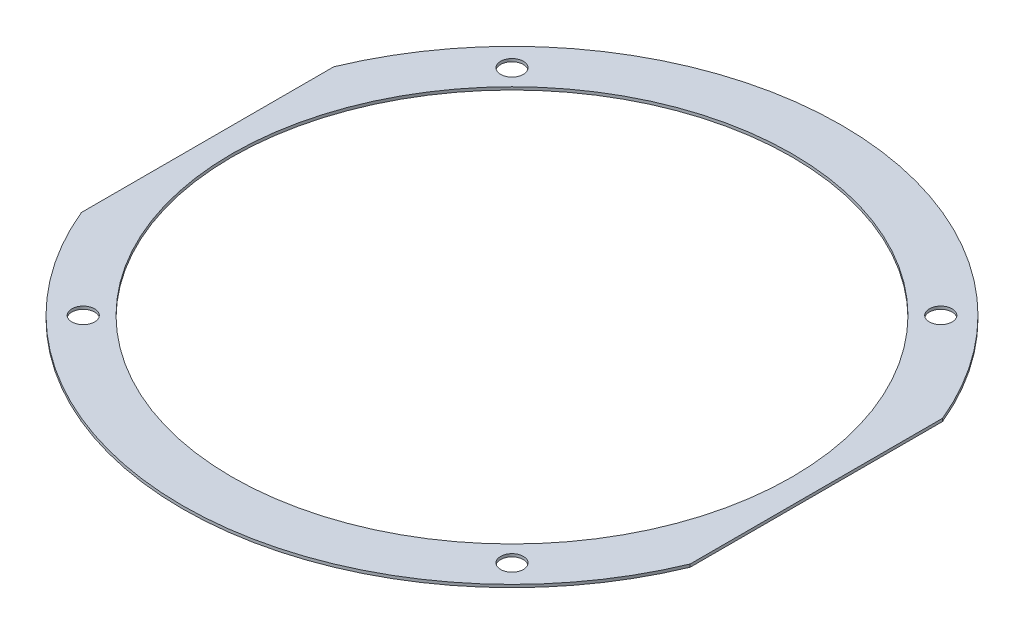
ISO-10303-21;
HEADER;
FILE_DESCRIPTION(('STEP AP214'),'2;1');
FILE_NAME('part.step','',(''),(''),'','','');
FILE_SCHEMA(('AUTOMOTIVE_DESIGN { 1 0 10303 214 1 1 1 1 }'));
ENDSEC;
DATA;
#1=APPLICATION_CONTEXT('core data for automotive mechanical design processes');
#2=APPLICATION_PROTOCOL_DEFINITION('international standard','automotive_design',2000,#1);
#3=PRODUCT_CONTEXT('',#1,'mechanical');
#4=PRODUCT('Part','Part','',(#3));
#5=PRODUCT_RELATED_PRODUCT_CATEGORY('part','',(#4));
#6=PRODUCT_DEFINITION_FORMATION('','',#4);
#7=PRODUCT_DEFINITION_CONTEXT('part definition',#1,'design');
#8=PRODUCT_DEFINITION('design','',#6,#7);
#9=PRODUCT_DEFINITION_SHAPE('','',#8);
#10=(LENGTH_UNIT() NAMED_UNIT(*) SI_UNIT(.MILLI.,.METRE.));
#11=(NAMED_UNIT(*) PLANE_ANGLE_UNIT() SI_UNIT($,.RADIAN.));
#12=(NAMED_UNIT(*) SI_UNIT($,.STERADIAN.) SOLID_ANGLE_UNIT());
#13=UNCERTAINTY_MEASURE_WITH_UNIT(LENGTH_MEASURE(1.E-05),#10,'distance_accuracy_value','');
#14=(GEOMETRIC_REPRESENTATION_CONTEXT(3) GLOBAL_UNCERTAINTY_ASSIGNED_CONTEXT((#13)) GLOBAL_UNIT_ASSIGNED_CONTEXT((#10,
#11,#12)) REPRESENTATION_CONTEXT('',''));
#15=CARTESIAN_POINT('',(0.,0.,0.));
#16=DIRECTION('',(0.,0.,1.));
#17=DIRECTION('',(1.,0.,0.));
#18=AXIS2_PLACEMENT_3D('',#15,#16,#17);
#19=CARTESIAN_POINT('',(0.,0.25,0.));
#20=DIRECTION('',(0.,1.,0.));
#21=DIRECTION('',(0.,0.,1.));
#22=AXIS2_PLACEMENT_3D('',#19,#20,#21);
#23=PLANE('',#22);
#24=CARTESIAN_POINT('',(-18.8398777252419,0.25,18.8398777252415));
#25=DIRECTION('',(0.,1.,0.));
#26=DIRECTION('',(0.,0.,1.));
#27=AXIS2_PLACEMENT_3D('',#24,#25,#26);
#28=CIRCLE('',#27,0.999999999999998);
#29=CARTESIAN_POINT('',(-18.8398777252419,0.25,19.8398777252415));
#30=VERTEX_POINT('',#29);
#31=EDGE_CURVE('E134',#30,#30,#28,.T.);
#32=ORIENTED_EDGE('',*,*,#31,.F.);
#33=EDGE_LOOP('',(#32));
#34=FACE_BOUND('',#33,.T.);
#35=CARTESIAN_POINT('',(18.8398777252419,0.25,-18.8398777252415));
#36=DIRECTION('',(0.,1.,0.));
#37=DIRECTION('',(0.,0.,1.));
#38=AXIS2_PLACEMENT_3D('',#35,#36,#37);
#39=CIRCLE('',#38,0.999999999999998);
#40=CARTESIAN_POINT('',(18.8398777252419,0.25,-17.8398777252415));
#41=VERTEX_POINT('',#40);
#42=EDGE_CURVE('E121',#41,#41,#39,.T.);
#43=ORIENTED_EDGE('',*,*,#42,.F.);
#44=EDGE_LOOP('',(#43));
#45=FACE_BOUND('',#44,.T.);
#46=CARTESIAN_POINT('',(0.,0.25,0.));
#47=DIRECTION('',(0.,1.,0.));
#48=DIRECTION('',(0.,0.,1.));
#49=AXIS2_PLACEMENT_3D('',#46,#47,#48);
#50=CIRCLE('',#49,28.9571402446805);
#51=CARTESIAN_POINT('',(26.75,0.25,-11.0884386254376));
#52=VERTEX_POINT('',#51);
#53=CARTESIAN_POINT('',(-26.75,0.25,-11.0884386254376));
#54=VERTEX_POINT('',#53);
#55=EDGE_CURVE('E93',#52,#54,#50,.T.);
#56=ORIENTED_EDGE('',*,*,#55,.T.);
#57=DIRECTION('',(0.,0.,1.));
#58=VECTOR('',#57,1.);
#59=CARTESIAN_POINT('',(-26.75,0.25,-11.0884386254376));
#60=LINE('',#59,#58);
#61=CARTESIAN_POINT('',(-26.75,0.25,11.0884386254376));
#62=VERTEX_POINT('',#61);
#63=EDGE_CURVE('E88',#54,#62,#60,.T.);
#64=ORIENTED_EDGE('',*,*,#63,.T.);
#65=CARTESIAN_POINT('',(0.,0.25,0.));
#66=DIRECTION('',(0.,1.,0.));
#67=DIRECTION('',(0.,0.,1.));
#68=AXIS2_PLACEMENT_3D('',#65,#66,#67);
#69=CIRCLE('',#68,28.9571402446805);
#70=CARTESIAN_POINT('',(26.75,0.25,11.0884386254376));
#71=VERTEX_POINT('',#70);
#72=EDGE_CURVE('E91',#62,#71,#69,.T.);
#73=ORIENTED_EDGE('',*,*,#72,.T.);
#74=DIRECTION('',(0.,0.,-1.));
#75=VECTOR('',#74,1.);
#76=CARTESIAN_POINT('',(26.75,0.25,11.0884386254376));
#77=LINE('',#76,#75);
#78=EDGE_CURVE('E59',#71,#52,#77,.T.);
#79=ORIENTED_EDGE('',*,*,#78,.T.);
#80=EDGE_LOOP('',(#56,#64,#73,#79));
#81=FACE_BOUND('',#80,.T.);
#82=CARTESIAN_POINT('',(18.8398777252414,0.25,18.839877725242));
#83=DIRECTION('',(0.,1.,0.));
#84=DIRECTION('',(0.,0.,1.));
#85=AXIS2_PLACEMENT_3D('',#82,#83,#84);
#86=CIRCLE('',#85,0.999999999999998);
#87=CARTESIAN_POINT('',(18.8398777252414,0.25,19.839877725242));
#88=VERTEX_POINT('',#87);
#89=EDGE_CURVE('E109',#88,#88,#86,.T.);
#90=ORIENTED_EDGE('',*,*,#89,.F.);
#91=EDGE_LOOP('',(#90));
#92=FACE_BOUND('',#91,.T.);
#93=CARTESIAN_POINT('',(-18.8398777252413,0.25,-18.8398777252421));
#94=DIRECTION('',(0.,1.,0.));
#95=DIRECTION('',(0.,0.,1.));
#96=AXIS2_PLACEMENT_3D('',#93,#94,#95);
#97=CIRCLE('',#96,0.999999999999998);
#98=CARTESIAN_POINT('',(-18.8398777252413,0.25,-17.8398777252421));
#99=VERTEX_POINT('',#98);
#100=EDGE_CURVE('E129',#99,#99,#97,.T.);
#101=ORIENTED_EDGE('',*,*,#100,.F.);
#102=EDGE_LOOP('',(#101));
#103=FACE_BOUND('',#102,.T.);
#104=CARTESIAN_POINT('',(0.,0.25,0.));
#105=DIRECTION('',(0.,1.,0.));
#106=DIRECTION('',(0.,0.,1.));
#107=AXIS2_PLACEMENT_3D('',#104,#105,#106);
#108=CIRCLE('',#107,24.6071402446805);
#109=CARTESIAN_POINT('',(0.,0.25,24.6071402446805));
#110=VERTEX_POINT('',#109);
#111=EDGE_CURVE('E141',#110,#110,#108,.T.);
#112=ORIENTED_EDGE('',*,*,#111,.F.);
#113=EDGE_LOOP('',(#112));
#114=FACE_BOUND('',#113,.T.);
#115=ADVANCED_FACE('F41',(#34,#45,#81,#92,#103,#114),#23,.T.);
#116=CARTESIAN_POINT('',(0.,0.,0.));
#117=DIRECTION('',(0.,1.,0.));
#118=DIRECTION('',(0.,0.,1.));
#119=AXIS2_PLACEMENT_3D('',#116,#117,#118);
#120=PLANE('',#119);
#121=CARTESIAN_POINT('',(0.,0.,0.));
#122=DIRECTION('',(0.,1.,0.));
#123=DIRECTION('',(0.,0.,1.));
#124=AXIS2_PLACEMENT_3D('',#121,#122,#123);
#125=CIRCLE('',#124,28.9571402446805);
#126=CARTESIAN_POINT('',(26.75,0.,-11.0884386254376));
#127=VERTEX_POINT('',#126);
#128=CARTESIAN_POINT('',(-26.75,0.,-11.0884386254376));
#129=VERTEX_POINT('',#128);
#130=EDGE_CURVE('E103',#127,#129,#125,.T.);
#131=ORIENTED_EDGE('',*,*,#130,.F.);
#132=DIRECTION('',(0.,0.,-1.));
#133=VECTOR('',#132,1.);
#134=CARTESIAN_POINT('',(26.75,0.,11.0884386254376));
#135=LINE('',#134,#133);
#136=CARTESIAN_POINT('',(26.75,0.,11.0884386254376));
#137=VERTEX_POINT('',#136);
#138=EDGE_CURVE('E83',#137,#127,#135,.T.);
#139=ORIENTED_EDGE('',*,*,#138,.F.);
#140=CARTESIAN_POINT('',(0.,0.,0.));
#141=DIRECTION('',(0.,1.,0.));
#142=DIRECTION('',(0.,0.,1.));
#143=AXIS2_PLACEMENT_3D('',#140,#141,#142);
#144=CIRCLE('',#143,28.9571402446805);
#145=CARTESIAN_POINT('',(-26.75,0.,11.0884386254376));
#146=VERTEX_POINT('',#145);
#147=EDGE_CURVE('E75',#146,#137,#144,.T.);
#148=ORIENTED_EDGE('',*,*,#147,.F.);
#149=DIRECTION('',(0.,0.,1.));
#150=VECTOR('',#149,1.);
#151=CARTESIAN_POINT('',(-26.75,0.,-11.0884386254376));
#152=LINE('',#151,#150);
#153=EDGE_CURVE('E100',#129,#146,#152,.T.);
#154=ORIENTED_EDGE('',*,*,#153,.F.);
#155=EDGE_LOOP('',(#131,#139,#148,#154));
#156=FACE_BOUND('',#155,.T.);
#157=CARTESIAN_POINT('',(18.8398777252414,0.,18.839877725242));
#158=DIRECTION('',(0.,1.,0.));
#159=DIRECTION('',(0.,0.,1.));
#160=AXIS2_PLACEMENT_3D('',#157,#158,#159);
#161=CIRCLE('',#160,0.999999999999998);
#162=CARTESIAN_POINT('',(18.8398777252414,0.,19.839877725242));
#163=VERTEX_POINT('',#162);
#164=EDGE_CURVE('E120',#163,#163,#161,.T.);
#165=ORIENTED_EDGE('',*,*,#164,.T.);
#166=EDGE_LOOP('',(#165));
#167=FACE_BOUND('',#166,.T.);
#168=CARTESIAN_POINT('',(18.8398777252419,0.,-18.8398777252415));
#169=DIRECTION('',(0.,1.,0.));
#170=DIRECTION('',(0.,0.,1.));
#171=AXIS2_PLACEMENT_3D('',#168,#169,#170);
#172=CIRCLE('',#171,0.999999999999998);
#173=CARTESIAN_POINT('',(18.8398777252419,0.,-17.8398777252415));
#174=VERTEX_POINT('',#173);
#175=EDGE_CURVE('E128',#174,#174,#172,.T.);
#176=ORIENTED_EDGE('',*,*,#175,.T.);
#177=EDGE_LOOP('',(#176));
#178=FACE_BOUND('',#177,.T.);
#179=CARTESIAN_POINT('',(-18.8398777252413,0.,-18.8398777252421));
#180=DIRECTION('',(0.,1.,0.));
#181=DIRECTION('',(0.,0.,1.));
#182=AXIS2_PLACEMENT_3D('',#179,#180,#181);
#183=CIRCLE('',#182,0.999999999999998);
#184=CARTESIAN_POINT('',(-18.8398777252413,0.,-17.8398777252421));
#185=VERTEX_POINT('',#184);
#186=EDGE_CURVE('E135',#185,#185,#183,.T.);
#187=ORIENTED_EDGE('',*,*,#186,.T.);
#188=EDGE_LOOP('',(#187));
#189=FACE_BOUND('',#188,.T.);
#190=CARTESIAN_POINT('',(-18.8398777252419,0.,18.8398777252415));
#191=DIRECTION('',(0.,1.,0.));
#192=DIRECTION('',(0.,0.,1.));
#193=AXIS2_PLACEMENT_3D('',#190,#191,#192);
#194=CIRCLE('',#193,0.999999999999998);
#195=CARTESIAN_POINT('',(-18.8398777252419,0.,19.8398777252415));
#196=VERTEX_POINT('',#195);
#197=EDGE_CURVE('E138',#196,#196,#194,.T.);
#198=ORIENTED_EDGE('',*,*,#197,.T.);
#199=EDGE_LOOP('',(#198));
#200=FACE_BOUND('',#199,.T.);
#201=CARTESIAN_POINT('',(0.,0.,0.));
#202=DIRECTION('',(0.,1.,0.));
#203=DIRECTION('',(0.,0.,1.));
#204=AXIS2_PLACEMENT_3D('',#201,#202,#203);
#205=CIRCLE('',#204,24.6071402446805);
#206=CARTESIAN_POINT('',(0.,0.,24.6071402446805));
#207=VERTEX_POINT('',#206);
#208=EDGE_CURVE('E143',#207,#207,#205,.T.);
#209=ORIENTED_EDGE('',*,*,#208,.T.);
#210=EDGE_LOOP('',(#209));
#211=FACE_BOUND('',#210,.T.);
#212=ADVANCED_FACE('F116',(#156,#167,#178,#189,#200,#211),#120,.F.);
#213=CARTESIAN_POINT('',(0.,0.25,0.));
#214=DIRECTION('',(0.,-1.,0.));
#215=DIRECTION('',(0.,0.,-1.));
#216=AXIS2_PLACEMENT_3D('',#213,#214,#215);
#217=CYLINDRICAL_SURFACE('',#216,28.9571402446805);
#218=ORIENTED_EDGE('',*,*,#130,.T.);
#219=DIRECTION('',(0.,-1.,0.));
#220=VECTOR('',#219,1.);
#221=CARTESIAN_POINT('',(-26.75,0.25,-11.0884386254376));
#222=LINE('',#221,#220);
#223=EDGE_CURVE('E11',#54,#129,#222,.T.);
#224=ORIENTED_EDGE('',*,*,#223,.F.);
#225=ORIENTED_EDGE('',*,*,#55,.F.);
#226=DIRECTION('',(0.,-1.,0.));
#227=VECTOR('',#226,1.);
#228=CARTESIAN_POINT('',(26.75,0.25,-11.0884386254376));
#229=LINE('',#228,#227);
#230=EDGE_CURVE('E102',#52,#127,#229,.T.);
#231=ORIENTED_EDGE('',*,*,#230,.T.);
#232=EDGE_LOOP('',(#218,#224,#225,#231));
#233=FACE_BOUND('',#232,.T.);
#234=ADVANCED_FACE('F43',(#233),#217,.T.);
#235=CARTESIAN_POINT('',(-26.75,0.25,-11.0884386254376));
#236=DIRECTION('',(1.,0.,0.));
#237=DIRECTION('',(0.,0.,-1.));
#238=AXIS2_PLACEMENT_3D('',#235,#236,#237);
#239=PLANE('',#238);
#240=ORIENTED_EDGE('',*,*,#153,.T.);
#241=DIRECTION('',(0.,-1.,0.));
#242=VECTOR('',#241,1.);
#243=CARTESIAN_POINT('',(-26.75,0.25,11.0884386254376));
#244=LINE('',#243,#242);
#245=EDGE_CURVE('E49',#62,#146,#244,.T.);
#246=ORIENTED_EDGE('',*,*,#245,.F.);
#247=ORIENTED_EDGE('',*,*,#63,.F.);
#248=ORIENTED_EDGE('',*,*,#223,.T.);
#249=EDGE_LOOP('',(#240,#246,#247,#248));
#250=FACE_BOUND('',#249,.T.);
#251=ADVANCED_FACE('F96',(#250),#239,.F.);
#252=CARTESIAN_POINT('',(0.,0.25,0.));
#253=DIRECTION('',(0.,-1.,0.));
#254=DIRECTION('',(0.,0.,-1.));
#255=AXIS2_PLACEMENT_3D('',#252,#253,#254);
#256=CYLINDRICAL_SURFACE('',#255,28.9571402446805);
#257=ORIENTED_EDGE('',*,*,#147,.T.);
#258=DIRECTION('',(0.,-1.,0.));
#259=VECTOR('',#258,1.);
#260=CARTESIAN_POINT('',(26.75,0.25,11.0884386254376));
#261=LINE('',#260,#259);
#262=EDGE_CURVE('E97',#71,#137,#261,.T.);
#263=ORIENTED_EDGE('',*,*,#262,.F.);
#264=ORIENTED_EDGE('',*,*,#72,.F.);
#265=ORIENTED_EDGE('',*,*,#245,.T.);
#266=EDGE_LOOP('',(#257,#263,#264,#265));
#267=FACE_BOUND('',#266,.T.);
#268=ADVANCED_FACE('F98',(#267),#256,.T.);
#269=CARTESIAN_POINT('',(26.75,0.25,11.0884386254376));
#270=DIRECTION('',(-1.,0.,0.));
#271=DIRECTION('',(0.,0.,1.));
#272=AXIS2_PLACEMENT_3D('',#269,#270,#271);
#273=PLANE('',#272);
#274=ORIENTED_EDGE('',*,*,#138,.T.);
#275=ORIENTED_EDGE('',*,*,#230,.F.);
#276=ORIENTED_EDGE('',*,*,#78,.F.);
#277=ORIENTED_EDGE('',*,*,#262,.T.);
#278=EDGE_LOOP('',(#274,#275,#276,#277));
#279=FACE_BOUND('',#278,.T.);
#280=ADVANCED_FACE('F111',(#279),#273,.F.);
#281=CARTESIAN_POINT('',(18.8398777252414,0.25,18.839877725242));
#282=DIRECTION('',(0.,-1.,0.));
#283=DIRECTION('',(0.,0.,-1.));
#284=AXIS2_PLACEMENT_3D('',#281,#282,#283);
#285=CYLINDRICAL_SURFACE('',#284,0.999999999999998);
#286=ORIENTED_EDGE('',*,*,#89,.T.);
#287=EDGE_LOOP('',(#286));
#288=FACE_BOUND('',#287,.T.);
#289=ORIENTED_EDGE('',*,*,#164,.F.);
#290=EDGE_LOOP('',(#289));
#291=FACE_BOUND('',#290,.T.);
#292=ADVANCED_FACE('F164',(#288,#291),#285,.F.);
#293=CARTESIAN_POINT('',(18.8398777252419,0.25,-18.8398777252415));
#294=DIRECTION('',(0.,-1.,0.));
#295=DIRECTION('',(0.,0.,-1.));
#296=AXIS2_PLACEMENT_3D('',#293,#294,#295);
#297=CYLINDRICAL_SURFACE('',#296,0.999999999999998);
#298=ORIENTED_EDGE('',*,*,#42,.T.);
#299=EDGE_LOOP('',(#298));
#300=FACE_BOUND('',#299,.T.);
#301=ORIENTED_EDGE('',*,*,#175,.F.);
#302=EDGE_LOOP('',(#301));
#303=FACE_BOUND('',#302,.T.);
#304=ADVANCED_FACE('F209',(#300,#303),#297,.F.);
#305=CARTESIAN_POINT('',(-18.8398777252413,0.25,-18.8398777252421));
#306=DIRECTION('',(0.,-1.,0.));
#307=DIRECTION('',(0.,0.,-1.));
#308=AXIS2_PLACEMENT_3D('',#305,#306,#307);
#309=CYLINDRICAL_SURFACE('',#308,0.999999999999998);
#310=ORIENTED_EDGE('',*,*,#100,.T.);
#311=EDGE_LOOP('',(#310));
#312=FACE_BOUND('',#311,.T.);
#313=ORIENTED_EDGE('',*,*,#186,.F.);
#314=EDGE_LOOP('',(#313));
#315=FACE_BOUND('',#314,.T.);
#316=ADVANCED_FACE('F218',(#312,#315),#309,.F.);
#317=CARTESIAN_POINT('',(-18.8398777252419,0.25,18.8398777252415));
#318=DIRECTION('',(0.,-1.,0.));
#319=DIRECTION('',(0.,0.,-1.));
#320=AXIS2_PLACEMENT_3D('',#317,#318,#319);
#321=CYLINDRICAL_SURFACE('',#320,0.999999999999998);
#322=ORIENTED_EDGE('',*,*,#31,.T.);
#323=EDGE_LOOP('',(#322));
#324=FACE_BOUND('',#323,.T.);
#325=ORIENTED_EDGE('',*,*,#197,.F.);
#326=EDGE_LOOP('',(#325));
#327=FACE_BOUND('',#326,.T.);
#328=ADVANCED_FACE('F222',(#324,#327),#321,.F.);
#329=CARTESIAN_POINT('',(0.,0.25,0.));
#330=DIRECTION('',(0.,-1.,0.));
#331=DIRECTION('',(0.,0.,-1.));
#332=AXIS2_PLACEMENT_3D('',#329,#330,#331);
#333=CYLINDRICAL_SURFACE('',#332,24.6071402446805);
#334=ORIENTED_EDGE('',*,*,#111,.T.);
#335=EDGE_LOOP('',(#334));
#336=FACE_BOUND('',#335,.T.);
#337=ORIENTED_EDGE('',*,*,#208,.F.);
#338=EDGE_LOOP('',(#337));
#339=FACE_BOUND('',#338,.T.);
#340=ADVANCED_FACE('F148',(#336,#339),#333,.F.);
#341=CLOSED_SHELL('',(#115,#212,#234,#251,#268,#280,#292,#304,#316,#328,#340));
#342=MANIFOLD_SOLID_BREP('B2',#341);
#343=ADVANCED_BREP_SHAPE_REPRESENTATION('',(#18,#342),#14);
#344=SHAPE_DEFINITION_REPRESENTATION(#9,#343);
ENDSEC;
END-ISO-10303-21;
